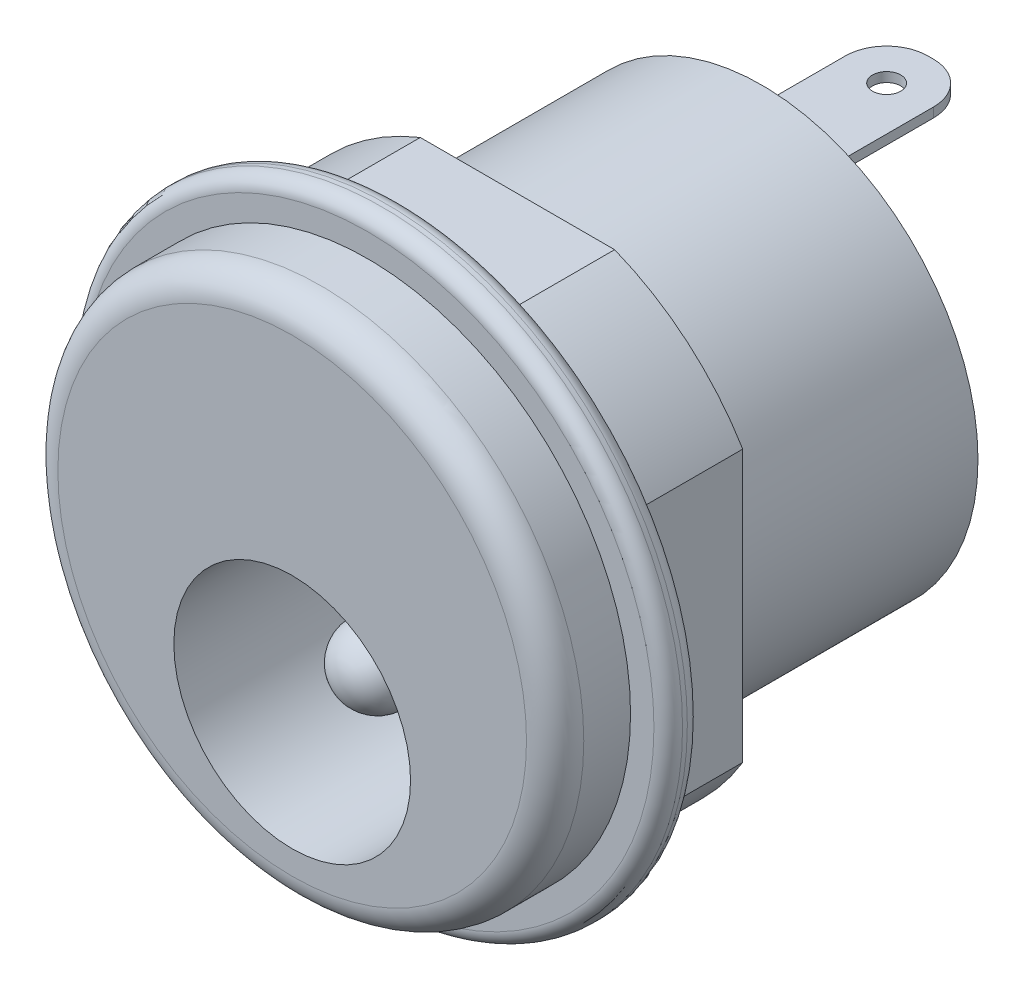
ISO-10303-21;
HEADER;
FILE_DESCRIPTION(('STEP AP214'),'2;1');
FILE_NAME('part.step','',(''),(''),'','','');
FILE_SCHEMA(('AUTOMOTIVE_DESIGN { 1 0 10303 214 1 1 1 1 }'));
ENDSEC;
DATA;
#1=APPLICATION_CONTEXT('core data for automotive mechanical design processes');
#2=APPLICATION_PROTOCOL_DEFINITION('international standard','automotive_design',2000,#1);
#3=PRODUCT_CONTEXT('',#1,'mechanical');
#4=PRODUCT('Part','Part','',(#3));
#5=PRODUCT_RELATED_PRODUCT_CATEGORY('part','',(#4));
#6=PRODUCT_DEFINITION_FORMATION('','',#4);
#7=PRODUCT_DEFINITION_CONTEXT('part definition',#1,'design');
#8=PRODUCT_DEFINITION('design','',#6,#7);
#9=PRODUCT_DEFINITION_SHAPE('','',#8);
#10=(LENGTH_UNIT() NAMED_UNIT(*) SI_UNIT(.MILLI.,.METRE.));
#11=(NAMED_UNIT(*) PLANE_ANGLE_UNIT() SI_UNIT($,.RADIAN.));
#12=(NAMED_UNIT(*) SI_UNIT($,.STERADIAN.) SOLID_ANGLE_UNIT());
#13=UNCERTAINTY_MEASURE_WITH_UNIT(LENGTH_MEASURE(1.E-05),#10,'distance_accuracy_value','');
#14=(GEOMETRIC_REPRESENTATION_CONTEXT(3) GLOBAL_UNCERTAINTY_ASSIGNED_CONTEXT((#13)) GLOBAL_UNIT_ASSIGNED_CONTEXT((#10,
#11,#12)) REPRESENTATION_CONTEXT('',''));
#15=CARTESIAN_POINT('',(0.,0.,0.));
#16=DIRECTION('',(0.,0.,1.));
#17=DIRECTION('',(1.,0.,0.));
#18=AXIS2_PLACEMENT_3D('',#15,#16,#17);
#19=CARTESIAN_POINT('',(0.,0.,-3.9878));
#20=DIRECTION('',(0.,0.,-1.));
#21=DIRECTION('',(-1.,0.,0.));
#22=AXIS2_PLACEMENT_3D('',#19,#20,#21);
#23=PLANE('',#22);
#24=CARTESIAN_POINT('',(0.,0.,-3.9878));
#25=DIRECTION('',(0.,0.,-1.));
#26=DIRECTION('',(-1.,0.,0.));
#27=AXIS2_PLACEMENT_3D('',#24,#25,#26);
#28=CIRCLE('',#27,5.7531);
#29=CARTESIAN_POINT('',(-5.7531,0.,-3.9878));
#30=VERTEX_POINT('',#29);
#31=EDGE_CURVE('E222',#30,#30,#28,.T.);
#32=ORIENTED_EDGE('',*,*,#31,.F.);
#33=EDGE_LOOP('',(#32));
#34=FACE_BOUND('',#33,.T.);
#35=CARTESIAN_POINT('',(0.,0.,-3.9878));
#36=DIRECTION('',(0.,0.,1.));
#37=DIRECTION('',(1.,0.,0.));
#38=AXIS2_PLACEMENT_3D('',#35,#36,#37);
#39=CIRCLE('',#38,6.9977);
#40=CARTESIAN_POINT('',(5.9944,3.61039802930369,-3.9878));
#41=VERTEX_POINT('',#40);
#42=CARTESIAN_POINT('',(2.58584599889475,6.5024,-3.9878));
#43=VERTEX_POINT('',#42);
#44=EDGE_CURVE('E191',#41,#43,#39,.T.);
#45=ORIENTED_EDGE('',*,*,#44,.F.);
#46=DIRECTION('',(0.,-1.,0.));
#47=VECTOR('',#46,1.);
#48=CARTESIAN_POINT('',(5.9944,0.,-3.9878));
#49=LINE('',#48,#47);
#50=CARTESIAN_POINT('',(5.9944,-3.61039802930369,-3.9878));
#51=VERTEX_POINT('',#50);
#52=EDGE_CURVE('E312',#41,#51,#49,.T.);
#53=ORIENTED_EDGE('',*,*,#52,.T.);
#54=CARTESIAN_POINT('',(2.58584599889475,-6.5024,-3.9878));
#55=VERTEX_POINT('',#54);
#56=EDGE_CURVE('E198',#55,#51,#39,.T.);
#57=ORIENTED_EDGE('',*,*,#56,.F.);
#58=DIRECTION('',(-1.,0.,0.));
#59=VECTOR('',#58,1.);
#60=CARTESIAN_POINT('',(0.,-6.5024,-3.9878));
#61=LINE('',#60,#59);
#62=CARTESIAN_POINT('',(-2.58584599889475,-6.5024,-3.9878));
#63=VERTEX_POINT('',#62);
#64=EDGE_CURVE('E331',#55,#63,#61,.T.);
#65=ORIENTED_EDGE('',*,*,#64,.T.);
#66=CARTESIAN_POINT('',(-5.9944,-3.61039802930369,-3.9878));
#67=VERTEX_POINT('',#66);
#68=EDGE_CURVE('E203',#67,#63,#39,.T.);
#69=ORIENTED_EDGE('',*,*,#68,.F.);
#70=DIRECTION('',(0.,1.,0.));
#71=VECTOR('',#70,1.);
#72=CARTESIAN_POINT('',(-5.9944,0.,-3.9878));
#73=LINE('',#72,#71);
#74=CARTESIAN_POINT('',(-5.9944,3.61039802930369,-3.9878));
#75=VERTEX_POINT('',#74);
#76=EDGE_CURVE('E322',#67,#75,#73,.T.);
#77=ORIENTED_EDGE('',*,*,#76,.T.);
#78=CARTESIAN_POINT('',(-2.58584599889475,6.5024,-3.9878));
#79=VERTEX_POINT('',#78);
#80=EDGE_CURVE('E349',#79,#75,#39,.T.);
#81=ORIENTED_EDGE('',*,*,#80,.F.);
#82=DIRECTION('',(1.,0.,0.));
#83=VECTOR('',#82,1.);
#84=CARTESIAN_POINT('',(0.,6.5024,-3.9878));
#85=LINE('',#84,#83);
#86=EDGE_CURVE('E192',#79,#43,#85,.T.);
#87=ORIENTED_EDGE('',*,*,#86,.T.);
#88=EDGE_LOOP('',(#45,#53,#57,#65,#69,#77,#81,#87));
#89=FACE_BOUND('',#88,.T.);
#90=ADVANCED_FACE('F37',(#34,#89),#23,.T.);
#91=CARTESIAN_POINT('',(0.,0.,6.77031441010075));
#92=DIRECTION('',(0.,0.,1.));
#93=DIRECTION('',(1.,0.,0.));
#94=AXIS2_PLACEMENT_3D('',#91,#92,#93);
#95=CYLINDRICAL_SURFACE('',#94,6.9977);
#96=CARTESIAN_POINT('',(0.,0.,-0.889));
#97=DIRECTION('',(0.,0.,1.));
#98=DIRECTION('',(1.,0.,0.));
#99=AXIS2_PLACEMENT_3D('',#96,#97,#98);
#100=CIRCLE('',#99,6.9977);
#101=CARTESIAN_POINT('',(5.9944,3.61039802930369,-0.889));
#102=VERTEX_POINT('',#101);
#103=CARTESIAN_POINT('',(2.58584599889475,6.5024,-0.889000000000001));
#104=VERTEX_POINT('',#103);
#105=EDGE_CURVE('E189',#102,#104,#100,.T.);
#106=ORIENTED_EDGE('',*,*,#105,.F.);
#107=DIRECTION('',(0.,0.,1.));
#108=VECTOR('',#107,1.);
#109=CARTESIAN_POINT('',(5.9944,3.61039802930369,6.77031441010075));
#110=LINE('',#109,#108);
#111=EDGE_CURVE('E310',#102,#41,#110,.F.);
#112=ORIENTED_EDGE('',*,*,#111,.T.);
#113=ORIENTED_EDGE('',*,*,#44,.T.);
#114=DIRECTION('',(0.,0.,1.));
#115=VECTOR('',#114,1.);
#116=CARTESIAN_POINT('',(2.58584599889475,6.5024,6.77031441010075));
#117=LINE('',#116,#115);
#118=EDGE_CURVE('E176',#43,#104,#117,.T.);
#119=ORIENTED_EDGE('',*,*,#118,.T.);
#120=EDGE_LOOP('',(#106,#112,#113,#119));
#121=FACE_BOUND('',#120,.T.);
#122=ADVANCED_FACE('F187',(#121),#95,.T.);
#123=ORIENTED_EDGE('',*,*,#56,.T.);
#124=DIRECTION('',(0.,0.,1.));
#125=VECTOR('',#124,1.);
#126=CARTESIAN_POINT('',(5.9944,-3.61039802930369,6.77031441010075));
#127=LINE('',#126,#125);
#128=CARTESIAN_POINT('',(5.9944,-3.61039802930369,-0.889000000000001));
#129=VERTEX_POINT('',#128);
#130=EDGE_CURVE('E315',#51,#129,#127,.T.);
#131=ORIENTED_EDGE('',*,*,#130,.T.);
#132=CARTESIAN_POINT('',(2.58584599889475,-6.5024,-0.889));
#133=VERTEX_POINT('',#132);
#134=EDGE_CURVE('E201',#133,#129,#100,.T.);
#135=ORIENTED_EDGE('',*,*,#134,.F.);
#136=DIRECTION('',(0.,0.,1.));
#137=VECTOR('',#136,1.);
#138=CARTESIAN_POINT('',(2.58584599889475,-6.5024,6.77031441010075));
#139=LINE('',#138,#137);
#140=EDGE_CURVE('E328',#133,#55,#139,.F.);
#141=ORIENTED_EDGE('',*,*,#140,.T.);
#142=EDGE_LOOP('',(#123,#131,#135,#141));
#143=FACE_BOUND('',#142,.T.);
#144=ADVANCED_FACE('F342',(#143),#95,.T.);
#145=CARTESIAN_POINT('',(-2.58584599889475,6.5024,-0.889));
#146=VERTEX_POINT('',#145);
#147=CARTESIAN_POINT('',(-5.9944,3.61039802930369,-0.889000000000001));
#148=VERTEX_POINT('',#147);
#149=EDGE_CURVE('E199',#146,#148,#100,.T.);
#150=ORIENTED_EDGE('',*,*,#149,.F.);
#151=DIRECTION('',(0.,0.,1.));
#152=VECTOR('',#151,1.);
#153=CARTESIAN_POINT('',(-2.58584599889475,6.5024,6.77031441010075));
#154=LINE('',#153,#152);
#155=EDGE_CURVE('E179',#146,#79,#154,.F.);
#156=ORIENTED_EDGE('',*,*,#155,.T.);
#157=ORIENTED_EDGE('',*,*,#80,.T.);
#158=DIRECTION('',(0.,0.,1.));
#159=VECTOR('',#158,1.);
#160=CARTESIAN_POINT('',(-5.9944,3.61039802930369,6.77031441010075));
#161=LINE('',#160,#159);
#162=EDGE_CURVE('E325',#75,#148,#161,.T.);
#163=ORIENTED_EDGE('',*,*,#162,.T.);
#164=EDGE_LOOP('',(#150,#156,#157,#163));
#165=FACE_BOUND('',#164,.T.);
#166=ADVANCED_FACE('F426',(#165),#95,.T.);
#167=CARTESIAN_POINT('',(-5.9944,-3.61039802930369,-0.889));
#168=VERTEX_POINT('',#167);
#169=CARTESIAN_POINT('',(-2.58584599889475,-6.5024,-0.889000000000001));
#170=VERTEX_POINT('',#169);
#171=EDGE_CURVE('E205',#168,#170,#100,.T.);
#172=ORIENTED_EDGE('',*,*,#171,.F.);
#173=DIRECTION('',(0.,0.,1.));
#174=VECTOR('',#173,1.);
#175=CARTESIAN_POINT('',(-5.9944,-3.61039802930369,6.77031441010075));
#176=LINE('',#175,#174);
#177=EDGE_CURVE('E193',#168,#67,#176,.F.);
#178=ORIENTED_EDGE('',*,*,#177,.T.);
#179=ORIENTED_EDGE('',*,*,#68,.T.);
#180=DIRECTION('',(0.,0.,1.));
#181=VECTOR('',#180,1.);
#182=CARTESIAN_POINT('',(-2.58584599889475,-6.5024,6.77031441010075));
#183=LINE('',#182,#181);
#184=EDGE_CURVE('E334',#63,#170,#183,.T.);
#185=ORIENTED_EDGE('',*,*,#184,.T.);
#186=EDGE_LOOP('',(#172,#178,#179,#185));
#187=FACE_BOUND('',#186,.T.);
#188=ADVANCED_FACE('F417',(#187),#95,.T.);
#189=CARTESIAN_POINT('',(0.,0.,-10.4902));
#190=DIRECTION('',(0.,0.,1.));
#191=DIRECTION('',(1.,0.,0.));
#192=AXIS2_PLACEMENT_3D('',#189,#190,#191);
#193=PLANE('',#192);
#194=DIRECTION('',(-1.,0.,0.));
#195=VECTOR('',#194,1.);
#196=CARTESIAN_POINT('',(1.175,3.8832574534043,-10.4902));
#197=LINE('',#196,#195);
#198=CARTESIAN_POINT('',(1.175,3.8832574534043,-10.4902));
#199=VERTEX_POINT('',#198);
#200=CARTESIAN_POINT('',(-1.175,3.8832574534043,-10.4902));
#201=VERTEX_POINT('',#200);
#202=EDGE_CURVE('E265',#199,#201,#197,.T.);
#203=ORIENTED_EDGE('',*,*,#202,.F.);
#204=DIRECTION('',(0.,1.,0.));
#205=VECTOR('',#204,1.);
#206=CARTESIAN_POINT('',(1.175,3.8832574534043,-10.4902));
#207=LINE('',#206,#205);
#208=CARTESIAN_POINT('',(1.175,4.1372574534043,-10.4902));
#209=VERTEX_POINT('',#208);
#210=EDGE_CURVE('E255',#199,#209,#207,.T.);
#211=ORIENTED_EDGE('',*,*,#210,.T.);
#212=DIRECTION('',(-1.,0.,0.));
#213=VECTOR('',#212,1.);
#214=CARTESIAN_POINT('',(1.175,4.1372574534043,-10.4902));
#215=LINE('',#214,#213);
#216=CARTESIAN_POINT('',(-1.175,4.1372574534043,-10.4902));
#217=VERTEX_POINT('',#216);
#218=EDGE_CURVE('E259',#209,#217,#215,.T.);
#219=ORIENTED_EDGE('',*,*,#218,.T.);
#220=DIRECTION('',(0.,-1.,0.));
#221=VECTOR('',#220,1.);
#222=CARTESIAN_POINT('',(-1.175,4.1372574534043,-10.4902));
#223=LINE('',#222,#221);
#224=EDGE_CURVE('E262',#217,#201,#223,.T.);
#225=ORIENTED_EDGE('',*,*,#224,.T.);
#226=EDGE_LOOP('',(#203,#211,#219,#225));
#227=FACE_BOUND('',#226,.T.);
#228=CARTESIAN_POINT('',(0.,0.,-10.4902));
#229=DIRECTION('',(0.,0.,1.));
#230=DIRECTION('',(1.,0.,0.));
#231=AXIS2_PLACEMENT_3D('',#228,#229,#230);
#232=CIRCLE('',#231,5.7531);
#233=CARTESIAN_POINT('',(5.7531,0.,-10.4902));
#234=VERTEX_POINT('',#233);
#235=EDGE_CURVE('E231',#234,#234,#232,.T.);
#236=ORIENTED_EDGE('',*,*,#235,.F.);
#237=EDGE_LOOP('',(#236));
#238=FACE_BOUND('',#237,.T.);
#239=DIRECTION('',(0.,1.,0.));
#240=VECTOR('',#239,1.);
#241=CARTESIAN_POINT('',(-2.44195723780729,1.175,-10.4902));
#242=LINE('',#241,#240);
#243=CARTESIAN_POINT('',(-2.44195723780729,1.175,-10.4902));
#244=VERTEX_POINT('',#243);
#245=CARTESIAN_POINT('',(-2.44195723780729,-1.175,-10.4902));
#246=VERTEX_POINT('',#245);
#247=EDGE_CURVE('E291',#244,#246,#242,.F.);
#248=ORIENTED_EDGE('',*,*,#247,.F.);
#249=DIRECTION('',(-1.,0.,0.));
#250=VECTOR('',#249,1.);
#251=CARTESIAN_POINT('',(-2.44195723780729,1.175,-10.4902));
#252=LINE('',#251,#250);
#253=CARTESIAN_POINT('',(-2.69595723780729,1.175,-10.4902));
#254=VERTEX_POINT('',#253);
#255=EDGE_CURVE('E281',#244,#254,#252,.T.);
#256=ORIENTED_EDGE('',*,*,#255,.T.);
#257=DIRECTION('',(0.,-1.,0.));
#258=VECTOR('',#257,1.);
#259=CARTESIAN_POINT('',(-2.69595723780729,1.175,-10.4902));
#260=LINE('',#259,#258);
#261=CARTESIAN_POINT('',(-2.69595723780729,-1.175,-10.4902));
#262=VERTEX_POINT('',#261);
#263=EDGE_CURVE('E285',#254,#262,#260,.T.);
#264=ORIENTED_EDGE('',*,*,#263,.T.);
#265=DIRECTION('',(1.,0.,0.));
#266=VECTOR('',#265,1.);
#267=CARTESIAN_POINT('',(-2.69595723780729,-1.175,-10.4902));
#268=LINE('',#267,#266);
#269=EDGE_CURVE('E288',#262,#246,#268,.T.);
#270=ORIENTED_EDGE('',*,*,#269,.T.);
#271=EDGE_LOOP('',(#248,#256,#264,#270));
#272=FACE_BOUND('',#271,.T.);
#273=ADVANCED_FACE('F414',(#227,#238,#272),#193,.F.);
#274=CARTESIAN_POINT('',(0.,0.,0.));
#275=DIRECTION('',(0.,0.,1.));
#276=DIRECTION('',(1.,0.,0.));
#277=AXIS2_PLACEMENT_3D('',#274,#275,#276);
#278=PLANE('',#277);
#279=CARTESIAN_POINT('',(0.,0.,0.));
#280=DIRECTION('',(0.,0.,1.));
#281=DIRECTION('',(1.,0.,0.));
#282=AXIS2_PLACEMENT_3D('',#279,#280,#281);
#283=CIRCLE('',#282,7.62);
#284=CARTESIAN_POINT('',(7.62,0.,0.));
#285=VERTEX_POINT('',#284);
#286=EDGE_CURVE('E219',#285,#285,#283,.T.);
#287=ORIENTED_EDGE('',*,*,#286,.T.);
#288=EDGE_LOOP('',(#287));
#289=FACE_BOUND('',#288,.T.);
#290=CARTESIAN_POINT('',(0.,0.,0.));
#291=DIRECTION('',(0.,0.,1.));
#292=DIRECTION('',(1.,0.,0.));
#293=AXIS2_PLACEMENT_3D('',#290,#291,#292);
#294=CIRCLE('',#293,6.9977);
#295=CARTESIAN_POINT('',(6.9977,0.,0.));
#296=VERTEX_POINT('',#295);
#297=EDGE_CURVE('E234',#296,#296,#294,.T.);
#298=ORIENTED_EDGE('',*,*,#297,.F.);
#299=EDGE_LOOP('',(#298));
#300=FACE_BOUND('',#299,.T.);
#301=ADVANCED_FACE('F416',(#289,#300),#278,.T.);
#302=CARTESIAN_POINT('',(0.,0.,-0.889));
#303=DIRECTION('',(0.,0.,1.));
#304=DIRECTION('',(1.,0.,0.));
#305=AXIS2_PLACEMENT_3D('',#302,#303,#304);
#306=PLANE('',#305);
#307=ORIENTED_EDGE('',*,*,#134,.T.);
#308=DIRECTION('',(0.,-1.,0.));
#309=VECTOR('',#308,1.);
#310=CARTESIAN_POINT('',(5.9944,6.5024,-0.889000000000001));
#311=LINE('',#310,#309);
#312=EDGE_CURVE('E182',#102,#129,#311,.T.);
#313=ORIENTED_EDGE('',*,*,#312,.F.);
#314=ORIENTED_EDGE('',*,*,#105,.T.);
#315=DIRECTION('',(1.,0.,0.));
#316=VECTOR('',#315,1.);
#317=CARTESIAN_POINT('',(5.9944,6.5024,-0.889000000000001));
#318=LINE('',#317,#316);
#319=EDGE_CURVE('E173',#146,#104,#318,.T.);
#320=ORIENTED_EDGE('',*,*,#319,.F.);
#321=ORIENTED_EDGE('',*,*,#149,.T.);
#322=DIRECTION('',(0.,1.,0.));
#323=VECTOR('',#322,1.);
#324=CARTESIAN_POINT('',(-5.9944,6.5024,-0.889000000000001));
#325=LINE('',#324,#323);
#326=EDGE_CURVE('E58',#168,#148,#325,.T.);
#327=ORIENTED_EDGE('',*,*,#326,.F.);
#328=ORIENTED_EDGE('',*,*,#171,.T.);
#329=DIRECTION('',(-1.,0.,0.));
#330=VECTOR('',#329,1.);
#331=CARTESIAN_POINT('',(5.9944,-6.5024,-0.889000000000001));
#332=LINE('',#331,#330);
#333=EDGE_CURVE('E52',#133,#170,#332,.T.);
#334=ORIENTED_EDGE('',*,*,#333,.F.);
#335=EDGE_LOOP('',(#307,#313,#314,#320,#321,#327,#328,#334));
#336=FACE_BOUND('',#335,.T.);
#337=CARTESIAN_POINT('',(0.,0.,-0.889));
#338=DIRECTION('',(0.,0.,1.));
#339=DIRECTION('',(1.,0.,0.));
#340=AXIS2_PLACEMENT_3D('',#337,#338,#339);
#341=CIRCLE('',#340,7.62);
#342=CARTESIAN_POINT('',(7.62,0.,-0.889));
#343=VERTEX_POINT('',#342);
#344=EDGE_CURVE('E207',#343,#343,#341,.T.);
#345=ORIENTED_EDGE('',*,*,#344,.F.);
#346=EDGE_LOOP('',(#345));
#347=FACE_BOUND('',#346,.T.);
#348=ADVANCED_FACE('F195',(#336,#347),#306,.F.);
#349=CARTESIAN_POINT('',(0.,0.,-0.508));
#350=DIRECTION('',(0.,0.,1.));
#351=DIRECTION('',(1.,0.,0.));
#352=AXIS2_PLACEMENT_3D('',#349,#350,#351);
#353=TOROIDAL_SURFACE('',#352,7.62,0.381);
#354=ORIENTED_EDGE('',*,*,#344,.T.);
#355=EDGE_LOOP('',(#354));
#356=FACE_BOUND('',#355,.T.);
#357=CARTESIAN_POINT('',(0.,0.,-0.508));
#358=DIRECTION('',(0.,0.,1.));
#359=DIRECTION('',(1.,0.,0.));
#360=AXIS2_PLACEMENT_3D('',#357,#358,#359);
#361=CIRCLE('',#360,8.001);
#362=CARTESIAN_POINT('',(8.001,0.,-0.508));
#363=VERTEX_POINT('',#362);
#364=EDGE_CURVE('E210',#363,#363,#361,.T.);
#365=ORIENTED_EDGE('',*,*,#364,.F.);
#366=EDGE_LOOP('',(#365));
#367=FACE_BOUND('',#366,.T.);
#368=ADVANCED_FACE('F543',(#356,#367),#353,.T.);
#369=CARTESIAN_POINT('',(0.,0.,6.77031441010075));
#370=DIRECTION('',(0.,0.,1.));
#371=DIRECTION('',(1.,0.,0.));
#372=AXIS2_PLACEMENT_3D('',#369,#370,#371);
#373=CYLINDRICAL_SURFACE('',#372,8.001);
#374=ORIENTED_EDGE('',*,*,#364,.T.);
#375=EDGE_LOOP('',(#374));
#376=FACE_BOUND('',#375,.T.);
#377=CARTESIAN_POINT('',(0.,0.,-0.381));
#378=DIRECTION('',(0.,0.,1.));
#379=DIRECTION('',(1.,0.,0.));
#380=AXIS2_PLACEMENT_3D('',#377,#378,#379);
#381=CIRCLE('',#380,8.001);
#382=CARTESIAN_POINT('',(8.001,0.,-0.381));
#383=VERTEX_POINT('',#382);
#384=EDGE_CURVE('E214',#383,#383,#381,.T.);
#385=ORIENTED_EDGE('',*,*,#384,.F.);
#386=EDGE_LOOP('',(#385));
#387=FACE_BOUND('',#386,.T.);
#388=ADVANCED_FACE('F539',(#376,#387),#373,.T.);
#389=CARTESIAN_POINT('',(0.,0.,-0.381));
#390=DIRECTION('',(0.,0.,1.));
#391=DIRECTION('',(1.,0.,0.));
#392=AXIS2_PLACEMENT_3D('',#389,#390,#391);
#393=TOROIDAL_SURFACE('',#392,7.62,0.381);
#394=ORIENTED_EDGE('',*,*,#384,.T.);
#395=EDGE_LOOP('',(#394));
#396=FACE_BOUND('',#395,.T.);
#397=ORIENTED_EDGE('',*,*,#286,.F.);
#398=EDGE_LOOP('',(#397));
#399=FACE_BOUND('',#398,.T.);
#400=ADVANCED_FACE('F513',(#396,#399),#393,.T.);
#401=CARTESIAN_POINT('',(0.,-2.4511,-6.8834));
#402=DIRECTION('',(0.,0.,1.));
#403=DIRECTION('',(1.,0.,0.));
#404=AXIS2_PLACEMENT_3D('',#401,#402,#403);
#405=PLANE('',#404);
#406=CARTESIAN_POINT('',(0.,-2.4511,-6.8834));
#407=DIRECTION('',(0.,0.,1.));
#408=DIRECTION('',(1.,0.,0.));
#409=AXIS2_PLACEMENT_3D('',#406,#407,#408);
#410=CIRCLE('',#409,1.);
#411=CARTESIAN_POINT('',(-1.,-2.4511,-6.8834));
#412=VERTEX_POINT('',#411);
#413=EDGE_CURVE('E241',#412,#412,#410,.T.);
#414=ORIENTED_EDGE('',*,*,#413,.F.);
#415=EDGE_LOOP('',(#414));
#416=FACE_BOUND('',#415,.T.);
#417=CARTESIAN_POINT('',(0.,-2.4511,-6.8834));
#418=DIRECTION('',(0.,0.,1.));
#419=DIRECTION('',(1.,0.,0.));
#420=AXIS2_PLACEMENT_3D('',#417,#418,#419);
#421=CIRCLE('',#420,3.1496);
#422=CARTESIAN_POINT('',(3.1496,-2.4511,-6.8834));
#423=VERTEX_POINT('',#422);
#424=EDGE_CURVE('E237',#423,#423,#421,.T.);
#425=ORIENTED_EDGE('',*,*,#424,.T.);
#426=EDGE_LOOP('',(#425));
#427=FACE_BOUND('',#426,.T.);
#428=ADVANCED_FACE('F509',(#416,#427),#405,.T.);
#429=CARTESIAN_POINT('',(0.,-2.4511,-6.8834));
#430=DIRECTION('',(0.,0.,1.));
#431=DIRECTION('',(1.,0.,0.));
#432=AXIS2_PLACEMENT_3D('',#429,#430,#431);
#433=CYLINDRICAL_SURFACE('',#432,3.1496);
#434=ORIENTED_EDGE('',*,*,#424,.F.);
#435=EDGE_LOOP('',(#434));
#436=FACE_BOUND('',#435,.T.);
#437=CARTESIAN_POINT('',(0.,-2.4511,2.0066));
#438=DIRECTION('',(0.,0.,1.));
#439=DIRECTION('',(1.,0.,0.));
#440=AXIS2_PLACEMENT_3D('',#437,#438,#439);
#441=CIRCLE('',#440,3.1496);
#442=CARTESIAN_POINT('',(3.1496,-2.4511,2.0066));
#443=VERTEX_POINT('',#442);
#444=EDGE_CURVE('E238',#443,#443,#441,.T.);
#445=ORIENTED_EDGE('',*,*,#444,.T.);
#446=EDGE_LOOP('',(#445));
#447=FACE_BOUND('',#446,.T.);
#448=ADVANCED_FACE('F512',(#436,#447),#433,.F.);
#449=CARTESIAN_POINT('',(0.,0.,2.0066));
#450=DIRECTION('',(0.,0.,1.));
#451=DIRECTION('',(1.,0.,0.));
#452=AXIS2_PLACEMENT_3D('',#449,#450,#451);
#453=PLANE('',#452);
#454=ORIENTED_EDGE('',*,*,#444,.F.);
#455=EDGE_LOOP('',(#454));
#456=FACE_BOUND('',#455,.T.);
#457=CARTESIAN_POINT('',(0.,0.,2.0066));
#458=DIRECTION('',(0.,0.,1.));
#459=DIRECTION('',(1.,0.,0.));
#460=AXIS2_PLACEMENT_3D('',#457,#458,#459);
#461=CIRCLE('',#460,6.2357);
#462=CARTESIAN_POINT('',(6.2357,0.,2.0066));
#463=VERTEX_POINT('',#462);
#464=EDGE_CURVE('E228',#463,#463,#461,.T.);
#465=ORIENTED_EDGE('',*,*,#464,.T.);
#466=EDGE_LOOP('',(#465));
#467=FACE_BOUND('',#466,.T.);
#468=ADVANCED_FACE('F516',(#456,#467),#453,.T.);
#469=CARTESIAN_POINT('',(0.,0.,1.2446));
#470=DIRECTION('',(0.,0.,1.));
#471=DIRECTION('',(1.,0.,0.));
#472=AXIS2_PLACEMENT_3D('',#469,#470,#471);
#473=TOROIDAL_SURFACE('',#472,6.2357,0.762);
#474=ORIENTED_EDGE('',*,*,#464,.F.);
#475=EDGE_LOOP('',(#474));
#476=FACE_BOUND('',#475,.T.);
#477=CARTESIAN_POINT('',(0.,0.,1.2446));
#478=DIRECTION('',(0.,0.,1.));
#479=DIRECTION('',(1.,0.,0.));
#480=AXIS2_PLACEMENT_3D('',#477,#478,#479);
#481=CIRCLE('',#480,6.9977);
#482=CARTESIAN_POINT('',(6.9977,0.,1.2446));
#483=VERTEX_POINT('',#482);
#484=EDGE_CURVE('E225',#483,#483,#481,.T.);
#485=ORIENTED_EDGE('',*,*,#484,.T.);
#486=EDGE_LOOP('',(#485));
#487=FACE_BOUND('',#486,.T.);
#488=ADVANCED_FACE('F524',(#476,#487),#473,.T.);
#489=CARTESIAN_POINT('',(0.,0.,7.8806295268906));
#490=DIRECTION('',(0.,0.,1.));
#491=DIRECTION('',(1.,0.,0.));
#492=AXIS2_PLACEMENT_3D('',#489,#490,#491);
#493=CYLINDRICAL_SURFACE('',#492,6.9977);
#494=ORIENTED_EDGE('',*,*,#484,.F.);
#495=EDGE_LOOP('',(#494));
#496=FACE_BOUND('',#495,.T.);
#497=ORIENTED_EDGE('',*,*,#297,.T.);
#498=EDGE_LOOP('',(#497));
#499=FACE_BOUND('',#498,.T.);
#500=ADVANCED_FACE('F519',(#496,#499),#493,.T.);
#501=CARTESIAN_POINT('',(0.,0.,7.8806295268906));
#502=DIRECTION('',(0.,0.,1.));
#503=DIRECTION('',(1.,0.,0.));
#504=AXIS2_PLACEMENT_3D('',#501,#502,#503);
#505=CYLINDRICAL_SURFACE('',#504,5.7531);
#506=ORIENTED_EDGE('',*,*,#31,.T.);
#507=EDGE_LOOP('',(#506));
#508=FACE_BOUND('',#507,.T.);
#509=ORIENTED_EDGE('',*,*,#235,.T.);
#510=EDGE_LOOP('',(#509));
#511=FACE_BOUND('',#510,.T.);
#512=ADVANCED_FACE('F507',(#508,#511),#505,.T.);
#513=CARTESIAN_POINT('',(0.,-2.4511,0.7366));
#514=DIRECTION('',(0.,0.,-1.));
#515=DIRECTION('',(-1.,0.,0.));
#516=AXIS2_PLACEMENT_3D('',#513,#514,#515);
#517=CYLINDRICAL_SURFACE('',#516,1.);
#518=CARTESIAN_POINT('',(0.,-2.4511,-0.263399999999999));
#519=DIRECTION('',(0.,0.,-1.));
#520=DIRECTION('',(-1.,0.,0.));
#521=AXIS2_PLACEMENT_3D('',#518,#519,#520);
#522=CIRCLE('',#521,1.);
#523=CARTESIAN_POINT('',(-1.,-2.4511,-0.263399999999999));
#524=VERTEX_POINT('',#523);
#525=EDGE_CURVE('E348',#524,#524,#522,.T.);
#526=CARTESIAN_POINT('',(-1.,-2.4511,-0.263399999999999));
#527=CARTESIAN_POINT('',(-1.,-2.4511,-0.332358333333333));
#528=CARTESIAN_POINT('',(-1.,-2.4511,-0.401316666666666));
#529=CARTESIAN_POINT('',(-1.,-2.4511,-0.539233333333333));
#530=CARTESIAN_POINT('',(-1.,-2.4511,-0.608191666666666));
#531=CARTESIAN_POINT('',(-1.,-2.4511,-0.746108333333333));
#532=CARTESIAN_POINT('',(-1.,-2.4511,-0.815066666666666));
#533=CARTESIAN_POINT('',(-1.,-2.4511,-0.952983333333333));
#534=CARTESIAN_POINT('',(-1.,-2.4511,-1.02194166666667));
#535=CARTESIAN_POINT('',(-1.,-2.4511,-1.15985833333333));
#536=CARTESIAN_POINT('',(-1.,-2.4511,-1.22881666666667));
#537=CARTESIAN_POINT('',(-1.,-2.4511,-1.36673333333333));
#538=CARTESIAN_POINT('',(-1.,-2.4511,-1.43569166666667));
#539=CARTESIAN_POINT('',(-1.,-2.4511,-1.57360833333333));
#540=CARTESIAN_POINT('',(-1.,-2.4511,-1.64256666666667));
#541=CARTESIAN_POINT('',(-1.,-2.4511,-1.78048333333333));
#542=CARTESIAN_POINT('',(-1.,-2.4511,-1.84944166666667));
#543=CARTESIAN_POINT('',(-1.,-2.4511,-1.98735833333333));
#544=CARTESIAN_POINT('',(-1.,-2.4511,-2.05631666666667));
#545=CARTESIAN_POINT('',(-1.,-2.4511,-2.19423333333333));
#546=CARTESIAN_POINT('',(-1.,-2.4511,-2.26319166666667));
#547=CARTESIAN_POINT('',(-1.,-2.4511,-2.40110833333333));
#548=CARTESIAN_POINT('',(-1.,-2.4511,-2.47006666666667));
#549=CARTESIAN_POINT('',(-1.,-2.4511,-2.60798333333333));
#550=CARTESIAN_POINT('',(-1.,-2.4511,-2.67694166666667));
#551=CARTESIAN_POINT('',(-1.,-2.4511,-2.81485833333333));
#552=CARTESIAN_POINT('',(-1.,-2.4511,-2.88381666666667));
#553=CARTESIAN_POINT('',(-1.,-2.4511,-3.02173333333333));
#554=CARTESIAN_POINT('',(-1.,-2.4511,-3.09069166666667));
#555=CARTESIAN_POINT('',(-1.,-2.4511,-3.22860833333333));
#556=CARTESIAN_POINT('',(-1.,-2.4511,-3.29756666666667));
#557=CARTESIAN_POINT('',(-1.,-2.4511,-3.43548333333333));
#558=CARTESIAN_POINT('',(-1.,-2.4511,-3.50444166666666));
#559=CARTESIAN_POINT('',(-1.,-2.4511,-3.64235833333333));
#560=CARTESIAN_POINT('',(-1.,-2.4511,-3.71131666666667));
#561=CARTESIAN_POINT('',(-1.,-2.4511,-3.84923333333333));
#562=CARTESIAN_POINT('',(-1.,-2.4511,-3.91819166666667));
#563=CARTESIAN_POINT('',(-1.,-2.4511,-4.05610833333333));
#564=CARTESIAN_POINT('',(-1.,-2.4511,-4.12506666666667));
#565=CARTESIAN_POINT('',(-1.,-2.4511,-4.26298333333333));
#566=CARTESIAN_POINT('',(-1.,-2.4511,-4.33194166666667));
#567=CARTESIAN_POINT('',(-1.,-2.4511,-4.46985833333333));
#568=CARTESIAN_POINT('',(-1.,-2.4511,-4.53881666666667));
#569=CARTESIAN_POINT('',(-1.,-2.4511,-4.67673333333333));
#570=CARTESIAN_POINT('',(-1.,-2.4511,-4.74569166666666));
#571=CARTESIAN_POINT('',(-1.,-2.4511,-4.88360833333333));
#572=CARTESIAN_POINT('',(-1.,-2.4511,-4.95256666666667));
#573=CARTESIAN_POINT('',(-1.,-2.4511,-5.09048333333333));
#574=CARTESIAN_POINT('',(-1.,-2.4511,-5.15944166666667));
#575=CARTESIAN_POINT('',(-1.,-2.4511,-5.29735833333333));
#576=CARTESIAN_POINT('',(-1.,-2.4511,-5.36631666666667));
#577=CARTESIAN_POINT('',(-1.,-2.4511,-5.50423333333333));
#578=CARTESIAN_POINT('',(-1.,-2.4511,-5.57319166666667));
#579=CARTESIAN_POINT('',(-1.,-2.4511,-5.71110833333333));
#580=CARTESIAN_POINT('',(-1.,-2.4511,-5.78006666666667));
#581=CARTESIAN_POINT('',(-1.,-2.4511,-5.91798333333333));
#582=CARTESIAN_POINT('',(-1.,-2.4511,-5.98694166666667));
#583=CARTESIAN_POINT('',(-1.,-2.4511,-6.12485833333333));
#584=CARTESIAN_POINT('',(-1.,-2.4511,-6.19381666666667));
#585=CARTESIAN_POINT('',(-1.,-2.4511,-6.33173333333333));
#586=CARTESIAN_POINT('',(-1.,-2.4511,-6.40069166666667));
#587=CARTESIAN_POINT('',(-1.,-2.4511,-6.53860833333333));
#588=CARTESIAN_POINT('',(-1.,-2.4511,-6.60756666666667));
#589=CARTESIAN_POINT('',(-1.,-2.4511,-6.74548333333333));
#590=CARTESIAN_POINT('',(-1.,-2.4511,-6.81444166666667));
#591=CARTESIAN_POINT('',(-1.,-2.4511,-6.8834));
#592=B_SPLINE_CURVE_WITH_KNOTS('',3,(#526,#527,#528,#529,#530,#531,#532,#533,#534,#535,#536,
#537,#538,#539,#540,#541,#542,#543,#544,#545,#546,#547,#548,#549,#550,#551,#552,#553,#554,#555,
#556,#557,#558,#559,#560,#561,#562,#563,#564,#565,#566,#567,#568,#569,#570,#571,#572,#573,#574,
#575,#576,#577,#578,#579,#580,#581,#582,#583,#584,#585,#586,#587,#588,#589,#590,#591),
.UNSPECIFIED.,.F.,.F.,(4,2,2,2,2,2,2,2,2,2,2,2,2,2,2,2,2,2,2,2,2,2,2,2,2,2,2,2,2,2,2,2,4),(0.,
0.206875,0.41375,0.620625,0.8275,1.034375,1.24125,1.448125,1.655,1.861875,2.06875,2.275625,
2.4825,2.689375,2.89625,3.103125,3.31,3.516875,3.72375,3.930625,4.1375,4.344375,4.55125,
4.758125,4.965,5.171875,5.37875,5.585625,5.7925,5.999375,6.20625,6.413125,6.62),.UNSPECIFIED.);
#593=EDGE_CURVE('BSEAM446',#524,#412,#592,.T.);
#594=ORIENTED_EDGE('',*,*,#525,.T.);
#595=ORIENTED_EDGE('',*,*,#413,.T.);
#596=ORIENTED_EDGE('',*,*,#593,.T.);
#597=ORIENTED_EDGE('',*,*,#593,.F.);
#598=EDGE_LOOP('',(#594,#596,#595,#597));
#599=FACE_BOUND('',#598,.T.);
#600=ADVANCED_FACE('F446',(#599),#517,.T.);
#601=CARTESIAN_POINT('',(0.,-2.4511,-0.2634));
#602=DIRECTION('',(0.,0.,1.));
#603=DIRECTION('',(1.,0.,0.));
#604=AXIS2_PLACEMENT_3D('',#601,#602,#603);
#605=SPHERICAL_SURFACE('',#604,1.);
#606=ORIENTED_EDGE('',*,*,#525,.F.);
#607=EDGE_LOOP('',(#606));
#608=FACE_BOUND('',#607,.T.);
#609=ADVANCED_FACE('F442',(#608),#605,.T.);
#610=CARTESIAN_POINT('',(1.175,3.8832574534043,-14.986));
#611=DIRECTION('',(0.,1.,0.));
#612=DIRECTION('',(0.,0.,1.));
#613=AXIS2_PLACEMENT_3D('',#610,#611,#612);
#614=PLANE('',#613);
#615=CARTESIAN_POINT('',(0.,3.8832574534043,-13.811758));
#616=DIRECTION('',(0.,1.,0.));
#617=DIRECTION('',(0.,0.,1.));
#618=AXIS2_PLACEMENT_3D('',#615,#616,#617);
#619=CIRCLE('',#618,0.374999999999991);
#620=CARTESIAN_POINT('',(0.,3.8832574534043,-13.436758));
#621=VERTEX_POINT('',#620);
#622=EDGE_CURVE('E304',#621,#621,#619,.T.);
#623=ORIENTED_EDGE('',*,*,#622,.T.);
#624=EDGE_LOOP('',(#623));
#625=FACE_BOUND('',#624,.T.);
#626=DIRECTION('',(0.,0.,1.));
#627=VECTOR('',#626,1.);
#628=CARTESIAN_POINT('',(-1.175,3.8832574534043,-14.986));
#629=LINE('',#628,#627);
#630=CARTESIAN_POINT('',(-1.175,3.8832574534043,-13.886));
#631=VERTEX_POINT('',#630);
#632=EDGE_CURVE('E246',#631,#201,#629,.T.);
#633=ORIENTED_EDGE('',*,*,#632,.F.);
#634=CARTESIAN_POINT('',(-0.075,3.8832574534043,-13.886));
#635=DIRECTION('',(0.,1.,0.));
#636=DIRECTION('',(0.,0.,1.));
#637=AXIS2_PLACEMENT_3D('',#634,#635,#636);
#638=CIRCLE('',#637,1.1);
#639=CARTESIAN_POINT('',(-0.075,3.8832574534043,-14.986));
#640=VERTEX_POINT('',#639);
#641=EDGE_CURVE('E359',#631,#640,#638,.F.);
#642=ORIENTED_EDGE('',*,*,#641,.T.);
#643=DIRECTION('',(-1.,0.,0.));
#644=VECTOR('',#643,1.);
#645=CARTESIAN_POINT('',(1.175,3.8832574534043,-14.986));
#646=LINE('',#645,#644);
#647=CARTESIAN_POINT('',(0.075,3.8832574534043,-14.986));
#648=VERTEX_POINT('',#647);
#649=EDGE_CURVE('E258',#648,#640,#646,.T.);
#650=ORIENTED_EDGE('',*,*,#649,.F.);
#651=CARTESIAN_POINT('',(0.075,3.8832574534043,-13.886));
#652=DIRECTION('',(0.,1.,0.));
#653=DIRECTION('',(0.,0.,1.));
#654=AXIS2_PLACEMENT_3D('',#651,#652,#653);
#655=CIRCLE('',#654,1.1);
#656=CARTESIAN_POINT('',(1.175,3.8832574534043,-13.886));
#657=VERTEX_POINT('',#656);
#658=EDGE_CURVE('E357',#648,#657,#655,.F.);
#659=ORIENTED_EDGE('',*,*,#658,.T.);
#660=DIRECTION('',(0.,0.,1.));
#661=VECTOR('',#660,1.);
#662=CARTESIAN_POINT('',(1.175,3.8832574534043,-14.986));
#663=LINE('',#662,#661);
#664=EDGE_CURVE('E252',#657,#199,#663,.T.);
#665=ORIENTED_EDGE('',*,*,#664,.T.);
#666=ORIENTED_EDGE('',*,*,#202,.T.);
#667=EDGE_LOOP('',(#633,#642,#650,#659,#665,#666));
#668=FACE_BOUND('',#667,.T.);
#669=ADVANCED_FACE('F445',(#625,#668),#614,.F.);
#670=CARTESIAN_POINT('',(-1.175,4.1372574534043,-14.986));
#671=DIRECTION('',(-1.,0.,0.));
#672=DIRECTION('',(0.,0.,1.));
#673=AXIS2_PLACEMENT_3D('',#670,#671,#672);
#674=PLANE('',#673);
#675=DIRECTION('',(0.,0.,1.));
#676=VECTOR('',#675,1.);
#677=CARTESIAN_POINT('',(-1.175,4.1372574534043,-14.986));
#678=LINE('',#677,#676);
#679=CARTESIAN_POINT('',(-1.175,4.1372574534043,-13.886));
#680=VERTEX_POINT('',#679);
#681=EDGE_CURVE('E248',#680,#217,#678,.T.);
#682=ORIENTED_EDGE('',*,*,#681,.F.);
#683=DIRECTION('',(0.,-1.,0.));
#684=VECTOR('',#683,1.);
#685=CARTESIAN_POINT('',(-1.175,3.8832574534043,-13.886));
#686=LINE('',#685,#684);
#687=EDGE_CURVE('E351',#680,#631,#686,.T.);
#688=ORIENTED_EDGE('',*,*,#687,.T.);
#689=ORIENTED_EDGE('',*,*,#632,.T.);
#690=ORIENTED_EDGE('',*,*,#224,.F.);
#691=EDGE_LOOP('',(#682,#688,#689,#690));
#692=FACE_BOUND('',#691,.T.);
#693=ADVANCED_FACE('F497',(#692),#674,.T.);
#694=CARTESIAN_POINT('',(1.175,4.1372574534043,-14.986));
#695=DIRECTION('',(0.,1.,0.));
#696=DIRECTION('',(0.,0.,1.));
#697=AXIS2_PLACEMENT_3D('',#694,#695,#696);
#698=PLANE('',#697);
#699=CARTESIAN_POINT('',(0.,4.1372574534043,-13.811758));
#700=DIRECTION('',(0.,1.,0.));
#701=DIRECTION('',(0.,0.,1.));
#702=AXIS2_PLACEMENT_3D('',#699,#700,#701);
#703=CIRCLE('',#702,0.374999999999988);
#704=CARTESIAN_POINT('',(0.,4.1372574534043,-13.436758));
#705=VERTEX_POINT('',#704);
#706=EDGE_CURVE('E307',#705,#705,#703,.T.);
#707=ORIENTED_EDGE('',*,*,#706,.F.);
#708=EDGE_LOOP('',(#707));
#709=FACE_BOUND('',#708,.T.);
#710=DIRECTION('',(-1.,0.,0.));
#711=VECTOR('',#710,1.);
#712=CARTESIAN_POINT('',(1.175,4.1372574534043,-14.986));
#713=LINE('',#712,#711);
#714=CARTESIAN_POINT('',(0.075,4.1372574534043,-14.986));
#715=VERTEX_POINT('',#714);
#716=CARTESIAN_POINT('',(-0.075,4.1372574534043,-14.986));
#717=VERTEX_POINT('',#716);
#718=EDGE_CURVE('E254',#715,#717,#713,.T.);
#719=ORIENTED_EDGE('',*,*,#718,.T.);
#720=CARTESIAN_POINT('',(-0.075,4.1372574534043,-13.886));
#721=DIRECTION('',(0.,1.,0.));
#722=DIRECTION('',(0.,0.,1.));
#723=AXIS2_PLACEMENT_3D('',#720,#721,#722);
#724=CIRCLE('',#723,1.1);
#725=EDGE_CURVE('E367',#717,#680,#724,.T.);
#726=ORIENTED_EDGE('',*,*,#725,.T.);
#727=ORIENTED_EDGE('',*,*,#681,.T.);
#728=ORIENTED_EDGE('',*,*,#218,.F.);
#729=DIRECTION('',(0.,0.,1.));
#730=VECTOR('',#729,1.);
#731=CARTESIAN_POINT('',(1.175,4.1372574534043,-14.986));
#732=LINE('',#731,#730);
#733=CARTESIAN_POINT('',(1.175,4.1372574534043,-13.886));
#734=VERTEX_POINT('',#733);
#735=EDGE_CURVE('E250',#734,#209,#732,.T.);
#736=ORIENTED_EDGE('',*,*,#735,.F.);
#737=CARTESIAN_POINT('',(0.075,4.1372574534043,-13.886));
#738=DIRECTION('',(0.,1.,0.));
#739=DIRECTION('',(0.,0.,1.));
#740=AXIS2_PLACEMENT_3D('',#737,#738,#739);
#741=CIRCLE('',#740,1.1);
#742=EDGE_CURVE('E365',#734,#715,#741,.T.);
#743=ORIENTED_EDGE('',*,*,#742,.T.);
#744=EDGE_LOOP('',(#719,#726,#727,#728,#736,#743));
#745=FACE_BOUND('',#744,.T.);
#746=ADVANCED_FACE('F493',(#709,#745),#698,.T.);
#747=CARTESIAN_POINT('',(1.175,3.8832574534043,-14.986));
#748=DIRECTION('',(1.,0.,0.));
#749=DIRECTION('',(0.,0.,-1.));
#750=AXIS2_PLACEMENT_3D('',#747,#748,#749);
#751=PLANE('',#750);
#752=ORIENTED_EDGE('',*,*,#664,.F.);
#753=DIRECTION('',(0.,1.,0.));
#754=VECTOR('',#753,1.);
#755=CARTESIAN_POINT('',(1.175,4.1372574534043,-13.886));
#756=LINE('',#755,#754);
#757=EDGE_CURVE('E369',#657,#734,#756,.T.);
#758=ORIENTED_EDGE('',*,*,#757,.T.);
#759=ORIENTED_EDGE('',*,*,#735,.T.);
#760=ORIENTED_EDGE('',*,*,#210,.F.);
#761=EDGE_LOOP('',(#752,#758,#759,#760));
#762=FACE_BOUND('',#761,.T.);
#763=ADVANCED_FACE('F489',(#762),#751,.T.);
#764=CARTESIAN_POINT('',(0.,0.,-14.986));
#765=DIRECTION('',(0.,0.,1.));
#766=DIRECTION('',(1.,0.,0.));
#767=AXIS2_PLACEMENT_3D('',#764,#765,#766);
#768=PLANE('',#767);
#769=ORIENTED_EDGE('',*,*,#649,.T.);
#770=DIRECTION('',(0.,-1.,0.));
#771=VECTOR('',#770,1.);
#772=CARTESIAN_POINT('',(-0.075,4.1372574534043,-14.986));
#773=LINE('',#772,#771);
#774=EDGE_CURVE('E363',#640,#717,#773,.F.);
#775=ORIENTED_EDGE('',*,*,#774,.T.);
#776=ORIENTED_EDGE('',*,*,#718,.F.);
#777=DIRECTION('',(0.,1.,0.));
#778=VECTOR('',#777,1.);
#779=CARTESIAN_POINT('',(0.075,3.8832574534043,-14.986));
#780=LINE('',#779,#778);
#781=EDGE_CURVE('E361',#715,#648,#780,.F.);
#782=ORIENTED_EDGE('',*,*,#781,.T.);
#783=EDGE_LOOP('',(#769,#775,#776,#782));
#784=FACE_BOUND('',#783,.T.);
#785=ADVANCED_FACE('F485',(#784),#768,.F.);
#786=CARTESIAN_POINT('',(-2.44195723780729,1.175,-14.986));
#787=DIRECTION('',(-1.,0.,0.));
#788=DIRECTION('',(0.,0.,1.));
#789=AXIS2_PLACEMENT_3D('',#786,#787,#788);
#790=PLANE('',#789);
#791=CARTESIAN_POINT('',(-2.44195723780729,0.,-13.811758));
#792=DIRECTION('',(1.,0.,0.));
#793=DIRECTION('',(0.,0.,-1.));
#794=AXIS2_PLACEMENT_3D('',#791,#792,#793);
#795=CIRCLE('',#794,0.374999999999999);
#796=CARTESIAN_POINT('',(-2.44195723780729,0.,-14.186758));
#797=VERTEX_POINT('',#796);
#798=EDGE_CURVE('E301',#797,#797,#795,.T.);
#799=ORIENTED_EDGE('',*,*,#798,.F.);
#800=EDGE_LOOP('',(#799));
#801=FACE_BOUND('',#800,.T.);
#802=DIRECTION('',(0.,0.,1.));
#803=VECTOR('',#802,1.);
#804=CARTESIAN_POINT('',(-2.44195723780729,-1.175,-14.986));
#805=LINE('',#804,#803);
#806=CARTESIAN_POINT('',(-2.44195723780729,-1.175,-13.886));
#807=VERTEX_POINT('',#806);
#808=EDGE_CURVE('E268',#807,#246,#805,.T.);
#809=ORIENTED_EDGE('',*,*,#808,.F.);
#810=CARTESIAN_POINT('',(-2.44195723780729,-0.075,-13.886));
#811=DIRECTION('',(-1.,0.,0.));
#812=DIRECTION('',(0.,0.,1.));
#813=AXIS2_PLACEMENT_3D('',#810,#811,#812);
#814=CIRCLE('',#813,1.1);
#815=CARTESIAN_POINT('',(-2.44195723780729,-0.075,-14.986));
#816=VERTEX_POINT('',#815);
#817=EDGE_CURVE('E377',#807,#816,#814,.F.);
#818=ORIENTED_EDGE('',*,*,#817,.T.);
#819=DIRECTION('',(0.,1.,0.));
#820=VECTOR('',#819,1.);
#821=CARTESIAN_POINT('',(-2.44195723780729,1.175,-14.986));
#822=LINE('',#821,#820);
#823=CARTESIAN_POINT('',(-2.44195723780729,0.075,-14.986));
#824=VERTEX_POINT('',#823);
#825=EDGE_CURVE('E284',#824,#816,#822,.F.);
#826=ORIENTED_EDGE('',*,*,#825,.F.);
#827=CARTESIAN_POINT('',(-2.44195723780729,0.075,-13.886));
#828=DIRECTION('',(-1.,0.,0.));
#829=DIRECTION('',(0.,0.,1.));
#830=AXIS2_PLACEMENT_3D('',#827,#828,#829);
#831=CIRCLE('',#830,1.1);
#832=CARTESIAN_POINT('',(-2.44195723780729,1.175,-13.886));
#833=VERTEX_POINT('',#832);
#834=EDGE_CURVE('E375',#824,#833,#831,.F.);
#835=ORIENTED_EDGE('',*,*,#834,.T.);
#836=DIRECTION('',(0.,0.,1.));
#837=VECTOR('',#836,1.);
#838=CARTESIAN_POINT('',(-2.44195723780729,1.175,-14.986));
#839=LINE('',#838,#837);
#840=EDGE_CURVE('E278',#833,#244,#839,.T.);
#841=ORIENTED_EDGE('',*,*,#840,.T.);
#842=ORIENTED_EDGE('',*,*,#247,.T.);
#843=EDGE_LOOP('',(#809,#818,#826,#835,#841,#842));
#844=FACE_BOUND('',#843,.T.);
#845=ADVANCED_FACE('F400',(#801,#844),#790,.F.);
#846=CARTESIAN_POINT('',(-2.69595723780729,-1.175,-14.986));
#847=DIRECTION('',(0.,-1.,0.));
#848=DIRECTION('',(0.,0.,-1.));
#849=AXIS2_PLACEMENT_3D('',#846,#847,#848);
#850=PLANE('',#849);
#851=DIRECTION('',(0.,0.,1.));
#852=VECTOR('',#851,1.);
#853=CARTESIAN_POINT('',(-2.69595723780729,-1.175,-14.986));
#854=LINE('',#853,#852);
#855=CARTESIAN_POINT('',(-2.69595723780729,-1.175,-13.886));
#856=VERTEX_POINT('',#855);
#857=EDGE_CURVE('E274',#856,#262,#854,.T.);
#858=ORIENTED_EDGE('',*,*,#857,.F.);
#859=DIRECTION('',(1.,0.,0.));
#860=VECTOR('',#859,1.);
#861=CARTESIAN_POINT('',(-2.69595723780729,-1.175,-13.886));
#862=LINE('',#861,#860);
#863=EDGE_CURVE('E372',#856,#807,#862,.T.);
#864=ORIENTED_EDGE('',*,*,#863,.T.);
#865=ORIENTED_EDGE('',*,*,#808,.T.);
#866=ORIENTED_EDGE('',*,*,#269,.F.);
#867=EDGE_LOOP('',(#858,#864,#865,#866));
#868=FACE_BOUND('',#867,.T.);
#869=ADVANCED_FACE('F395',(#868),#850,.T.);
#870=CARTESIAN_POINT('',(-2.69595723780729,1.175,-14.986));
#871=DIRECTION('',(-1.,0.,0.));
#872=DIRECTION('',(0.,0.,1.));
#873=AXIS2_PLACEMENT_3D('',#870,#871,#872);
#874=PLANE('',#873);
#875=CARTESIAN_POINT('',(-2.69595723780729,0.,-13.811758));
#876=DIRECTION('',(-1.,0.,0.));
#877=DIRECTION('',(0.,0.,1.));
#878=AXIS2_PLACEMENT_3D('',#875,#876,#877);
#879=CIRCLE('',#878,0.374999999999999);
#880=CARTESIAN_POINT('',(-2.69595723780729,0.,-13.436758));
#881=VERTEX_POINT('',#880);
#882=EDGE_CURVE('E294',#881,#881,#879,.T.);
#883=ORIENTED_EDGE('',*,*,#882,.F.);
#884=EDGE_LOOP('',(#883));
#885=FACE_BOUND('',#884,.T.);
#886=DIRECTION('',(0.,-1.,0.));
#887=VECTOR('',#886,1.);
#888=CARTESIAN_POINT('',(-2.69595723780729,1.175,-14.986));
#889=LINE('',#888,#887);
#890=CARTESIAN_POINT('',(-2.69595723780729,0.075,-14.986));
#891=VERTEX_POINT('',#890);
#892=CARTESIAN_POINT('',(-2.69595723780729,-0.075,-14.986));
#893=VERTEX_POINT('',#892);
#894=EDGE_CURVE('E280',#891,#893,#889,.T.);
#895=ORIENTED_EDGE('',*,*,#894,.T.);
#896=CARTESIAN_POINT('',(-2.69595723780729,-0.075,-13.886));
#897=DIRECTION('',(-1.,0.,0.));
#898=DIRECTION('',(0.,0.,1.));
#899=AXIS2_PLACEMENT_3D('',#896,#897,#898);
#900=CIRCLE('',#899,1.1);
#901=EDGE_CURVE('E45',#893,#856,#900,.T.);
#902=ORIENTED_EDGE('',*,*,#901,.T.);
#903=ORIENTED_EDGE('',*,*,#857,.T.);
#904=ORIENTED_EDGE('',*,*,#263,.F.);
#905=DIRECTION('',(0.,0.,1.));
#906=VECTOR('',#905,1.);
#907=CARTESIAN_POINT('',(-2.69595723780729,1.175,-14.986));
#908=LINE('',#907,#906);
#909=CARTESIAN_POINT('',(-2.69595723780729,1.175,-13.886));
#910=VERTEX_POINT('',#909);
#911=EDGE_CURVE('E276',#910,#254,#908,.T.);
#912=ORIENTED_EDGE('',*,*,#911,.F.);
#913=CARTESIAN_POINT('',(-2.69595723780729,0.075,-13.886));
#914=DIRECTION('',(-1.,0.,0.));
#915=DIRECTION('',(0.,0.,1.));
#916=AXIS2_PLACEMENT_3D('',#913,#914,#915);
#917=CIRCLE('',#916,1.1);
#918=EDGE_CURVE('E383',#910,#891,#917,.T.);
#919=ORIENTED_EDGE('',*,*,#918,.T.);
#920=EDGE_LOOP('',(#895,#902,#903,#904,#912,#919));
#921=FACE_BOUND('',#920,.T.);
#922=ADVANCED_FACE('F387',(#885,#921),#874,.T.);
#923=CARTESIAN_POINT('',(-2.44195723780729,1.175,-14.986));
#924=DIRECTION('',(0.,1.,0.));
#925=DIRECTION('',(0.,0.,1.));
#926=AXIS2_PLACEMENT_3D('',#923,#924,#925);
#927=PLANE('',#926);
#928=ORIENTED_EDGE('',*,*,#840,.F.);
#929=DIRECTION('',(-1.,0.,0.));
#930=VECTOR('',#929,1.);
#931=CARTESIAN_POINT('',(-2.44195723780729,1.175,-13.886));
#932=LINE('',#931,#930);
#933=EDGE_CURVE('E12',#833,#910,#932,.T.);
#934=ORIENTED_EDGE('',*,*,#933,.T.);
#935=ORIENTED_EDGE('',*,*,#911,.T.);
#936=ORIENTED_EDGE('',*,*,#255,.F.);
#937=EDGE_LOOP('',(#928,#934,#935,#936));
#938=FACE_BOUND('',#937,.T.);
#939=ADVANCED_FACE('F410',(#938),#927,.T.);
#940=CARTESIAN_POINT('',(0.,0.,-14.986));
#941=DIRECTION('',(0.,0.,-1.));
#942=DIRECTION('',(-1.,0.,0.));
#943=AXIS2_PLACEMENT_3D('',#940,#941,#942);
#944=PLANE('',#943);
#945=ORIENTED_EDGE('',*,*,#825,.T.);
#946=DIRECTION('',(1.,0.,0.));
#947=VECTOR('',#946,1.);
#948=CARTESIAN_POINT('',(0.,-0.075,-14.986));
#949=LINE('',#948,#947);
#950=EDGE_CURVE('E381',#816,#893,#949,.F.);
#951=ORIENTED_EDGE('',*,*,#950,.T.);
#952=ORIENTED_EDGE('',*,*,#894,.F.);
#953=DIRECTION('',(-1.,0.,0.));
#954=VECTOR('',#953,1.);
#955=CARTESIAN_POINT('',(0.,0.075,-14.986));
#956=LINE('',#955,#954);
#957=EDGE_CURVE('E379',#891,#824,#956,.F.);
#958=ORIENTED_EDGE('',*,*,#957,.T.);
#959=EDGE_LOOP('',(#945,#951,#952,#958));
#960=FACE_BOUND('',#959,.T.);
#961=ADVANCED_FACE('F403',(#960),#944,.T.);
#962=CARTESIAN_POINT('',(-0.075,4.1372574534043,-13.886));
#963=DIRECTION('',(0.,1.,0.));
#964=DIRECTION('',(0.,0.,1.));
#965=AXIS2_PLACEMENT_3D('',#962,#963,#964);
#966=CYLINDRICAL_SURFACE('',#965,1.1);
#967=ORIENTED_EDGE('',*,*,#725,.F.);
#968=ORIENTED_EDGE('',*,*,#774,.F.);
#969=ORIENTED_EDGE('',*,*,#641,.F.);
#970=ORIENTED_EDGE('',*,*,#687,.F.);
#971=EDGE_LOOP('',(#967,#968,#969,#970));
#972=FACE_BOUND('',#971,.T.);
#973=ADVANCED_FACE('F448',(#972),#966,.T.);
#974=CARTESIAN_POINT('',(0.075,3.8832574534043,-13.886));
#975=DIRECTION('',(0.,-1.,0.));
#976=DIRECTION('',(0.,0.,-1.));
#977=AXIS2_PLACEMENT_3D('',#974,#975,#976);
#978=CYLINDRICAL_SURFACE('',#977,1.1);
#979=ORIENTED_EDGE('',*,*,#658,.F.);
#980=ORIENTED_EDGE('',*,*,#781,.F.);
#981=ORIENTED_EDGE('',*,*,#742,.F.);
#982=ORIENTED_EDGE('',*,*,#757,.F.);
#983=EDGE_LOOP('',(#979,#980,#981,#982));
#984=FACE_BOUND('',#983,.T.);
#985=ADVANCED_FACE('F451',(#984),#978,.T.);
#986=CARTESIAN_POINT('',(-2.69595723780729,-0.075,-13.886));
#987=DIRECTION('',(1.,0.,0.));
#988=DIRECTION('',(0.,0.,-1.));
#989=AXIS2_PLACEMENT_3D('',#986,#987,#988);
#990=CYLINDRICAL_SURFACE('',#989,1.1);
#991=ORIENTED_EDGE('',*,*,#901,.F.);
#992=ORIENTED_EDGE('',*,*,#950,.F.);
#993=ORIENTED_EDGE('',*,*,#817,.F.);
#994=ORIENTED_EDGE('',*,*,#863,.F.);
#995=EDGE_LOOP('',(#991,#992,#993,#994));
#996=FACE_BOUND('',#995,.T.);
#997=ADVANCED_FACE('F397',(#996),#990,.T.);
#998=CARTESIAN_POINT('',(-2.44195723780729,0.075,-13.886));
#999=DIRECTION('',(-1.,0.,0.));
#1000=DIRECTION('',(0.,0.,1.));
#1001=AXIS2_PLACEMENT_3D('',#998,#999,#1000);
#1002=CYLINDRICAL_SURFACE('',#1001,1.1);
#1003=ORIENTED_EDGE('',*,*,#834,.F.);
#1004=ORIENTED_EDGE('',*,*,#957,.F.);
#1005=ORIENTED_EDGE('',*,*,#918,.F.);
#1006=ORIENTED_EDGE('',*,*,#933,.F.);
#1007=EDGE_LOOP('',(#1003,#1004,#1005,#1006));
#1008=FACE_BOUND('',#1007,.T.);
#1009=ADVANCED_FACE('F39',(#1008),#1002,.T.);
#1010=CARTESIAN_POINT('',(-2.44195723780729,0.,-13.811758));
#1011=DIRECTION('',(1.,0.,0.));
#1012=DIRECTION('',(0.,0.,-1.));
#1013=AXIS2_PLACEMENT_3D('',#1010,#1011,#1012);
#1014=CYLINDRICAL_SURFACE('',#1013,0.374999999999999);
#1015=ORIENTED_EDGE('',*,*,#882,.T.);
#1016=EDGE_LOOP('',(#1015));
#1017=FACE_BOUND('',#1016,.T.);
#1018=ORIENTED_EDGE('',*,*,#798,.T.);
#1019=EDGE_LOOP('',(#1018));
#1020=FACE_BOUND('',#1019,.T.);
#1021=ADVANCED_FACE('F459',(#1017,#1020),#1014,.F.);
#1022=CARTESIAN_POINT('',(0.,4.1372574534043,-13.811758));
#1023=DIRECTION('',(0.,1.,0.));
#1024=DIRECTION('',(0.,0.,1.));
#1025=AXIS2_PLACEMENT_3D('',#1022,#1023,#1024);
#1026=CYLINDRICAL_SURFACE('',#1025,0.374999999999991);
#1027=ORIENTED_EDGE('',*,*,#706,.T.);
#1028=EDGE_LOOP('',(#1027));
#1029=FACE_BOUND('',#1028,.T.);
#1030=ORIENTED_EDGE('',*,*,#622,.F.);
#1031=EDGE_LOOP('',(#1030));
#1032=FACE_BOUND('',#1031,.T.);
#1033=ADVANCED_FACE('F463',(#1029,#1032),#1026,.F.);
#1034=CARTESIAN_POINT('',(5.9944,6.5024,22.590689350508));
#1035=DIRECTION('',(1.,0.,0.));
#1036=DIRECTION('',(0.,0.,-1.));
#1037=AXIS2_PLACEMENT_3D('',#1034,#1035,#1036);
#1038=PLANE('',#1037);
#1039=ORIENTED_EDGE('',*,*,#312,.T.);
#1040=ORIENTED_EDGE('',*,*,#130,.F.);
#1041=ORIENTED_EDGE('',*,*,#52,.F.);
#1042=ORIENTED_EDGE('',*,*,#111,.F.);
#1043=EDGE_LOOP('',(#1039,#1040,#1041,#1042));
#1044=FACE_BOUND('',#1043,.T.);
#1045=ADVANCED_FACE('F340',(#1044),#1038,.T.);
#1046=CARTESIAN_POINT('',(5.9944,6.5024,22.590689350508));
#1047=DIRECTION('',(0.,1.,0.));
#1048=DIRECTION('',(0.,0.,1.));
#1049=AXIS2_PLACEMENT_3D('',#1046,#1047,#1048);
#1050=PLANE('',#1049);
#1051=ORIENTED_EDGE('',*,*,#319,.T.);
#1052=ORIENTED_EDGE('',*,*,#118,.F.);
#1053=ORIENTED_EDGE('',*,*,#86,.F.);
#1054=ORIENTED_EDGE('',*,*,#155,.F.);
#1055=EDGE_LOOP('',(#1051,#1052,#1053,#1054));
#1056=FACE_BOUND('',#1055,.T.);
#1057=ADVANCED_FACE('F175',(#1056),#1050,.T.);
#1058=CARTESIAN_POINT('',(-5.9944,6.5024,22.590689350508));
#1059=DIRECTION('',(-1.,0.,0.));
#1060=DIRECTION('',(0.,0.,1.));
#1061=AXIS2_PLACEMENT_3D('',#1058,#1059,#1060);
#1062=PLANE('',#1061);
#1063=ORIENTED_EDGE('',*,*,#326,.T.);
#1064=ORIENTED_EDGE('',*,*,#162,.F.);
#1065=ORIENTED_EDGE('',*,*,#76,.F.);
#1066=ORIENTED_EDGE('',*,*,#177,.F.);
#1067=EDGE_LOOP('',(#1063,#1064,#1065,#1066));
#1068=FACE_BOUND('',#1067,.T.);
#1069=ADVANCED_FACE('F734',(#1068),#1062,.T.);
#1070=CARTESIAN_POINT('',(5.9944,-6.5024,22.590689350508));
#1071=DIRECTION('',(0.,-1.,0.));
#1072=DIRECTION('',(0.,0.,-1.));
#1073=AXIS2_PLACEMENT_3D('',#1070,#1071,#1072);
#1074=PLANE('',#1073);
#1075=ORIENTED_EDGE('',*,*,#333,.T.);
#1076=ORIENTED_EDGE('',*,*,#184,.F.);
#1077=ORIENTED_EDGE('',*,*,#64,.F.);
#1078=ORIENTED_EDGE('',*,*,#140,.F.);
#1079=EDGE_LOOP('',(#1075,#1076,#1077,#1078));
#1080=FACE_BOUND('',#1079,.T.);
#1081=ADVANCED_FACE('F737',(#1080),#1074,.T.);
#1082=CLOSED_SHELL('',(#90,#122,#144,#166,#188,#273,#301,#348,#368,#388,#400,#428,#448,#468,
#488,#500,#512,#600,#609,#669,#693,#746,#763,#785,#845,#869,#922,#939,#961,#973,#985,#997,#1009,
#1021,#1033,#1045,#1057,#1069,#1081));
#1083=MANIFOLD_SOLID_BREP('B2',#1082);
#1084=ADVANCED_BREP_SHAPE_REPRESENTATION('',(#18,#1083),#14);
#1085=SHAPE_DEFINITION_REPRESENTATION(#9,#1084);
ENDSEC;
END-ISO-10303-21;
